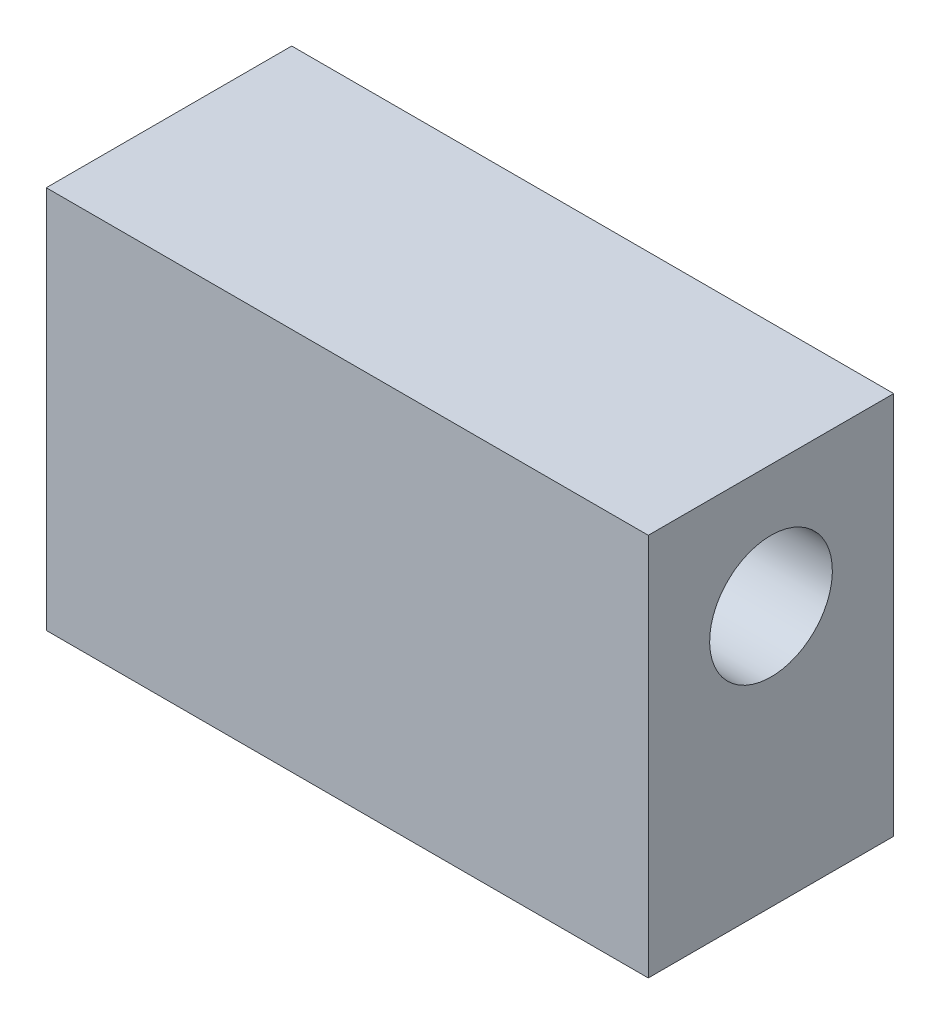
ISO-10303-21;
HEADER;
FILE_DESCRIPTION(('STEP AP214'),'2;1');
FILE_NAME('part.step','',(''),(''),'','','');
FILE_SCHEMA(('AUTOMOTIVE_DESIGN { 1 0 10303 214 1 1 1 1 }'));
ENDSEC;
DATA;
#1=APPLICATION_CONTEXT('core data for automotive mechanical design processes');
#2=APPLICATION_PROTOCOL_DEFINITION('international standard','automotive_design',2000,#1);
#3=PRODUCT_CONTEXT('',#1,'mechanical');
#4=PRODUCT('Part','Part','',(#3));
#5=PRODUCT_RELATED_PRODUCT_CATEGORY('part','',(#4));
#6=PRODUCT_DEFINITION_FORMATION('','',#4);
#7=PRODUCT_DEFINITION_CONTEXT('part definition',#1,'design');
#8=PRODUCT_DEFINITION('design','',#6,#7);
#9=PRODUCT_DEFINITION_SHAPE('','',#8);
#10=(LENGTH_UNIT() NAMED_UNIT(*) SI_UNIT(.MILLI.,.METRE.));
#11=(NAMED_UNIT(*) PLANE_ANGLE_UNIT() SI_UNIT($,.RADIAN.));
#12=(NAMED_UNIT(*) SI_UNIT($,.STERADIAN.) SOLID_ANGLE_UNIT());
#13=UNCERTAINTY_MEASURE_WITH_UNIT(LENGTH_MEASURE(1.E-05),#10,'distance_accuracy_value','');
#14=(GEOMETRIC_REPRESENTATION_CONTEXT(3) GLOBAL_UNCERTAINTY_ASSIGNED_CONTEXT((#13)) GLOBAL_UNIT_ASSIGNED_CONTEXT((#10,
#11,#12)) REPRESENTATION_CONTEXT('',''));
#15=CARTESIAN_POINT('',(0.,0.,0.));
#16=DIRECTION('',(0.,0.,1.));
#17=DIRECTION('',(1.,0.,0.));
#18=AXIS2_PLACEMENT_3D('',#15,#16,#17);
#19=CARTESIAN_POINT('',(0.,-19.8376419710467,6.35));
#20=DIRECTION('',(0.,1.,0.));
#21=DIRECTION('',(-1.,0.,0.));
#22=AXIS2_PLACEMENT_3D('',#19,#20,#21);
#23=PLANE('',#22);
#24=CARTESIAN_POINT('',(23.3612811681514,-19.8376419710467,0.));
#25=DIRECTION('',(0.,1.,0.));
#26=DIRECTION('',(-1.,0.,0.));
#27=AXIS2_PLACEMENT_3D('',#24,#25,#26);
#28=ELLIPSE('',#27,3.66617420935412,3.175);
#29=CARTESIAN_POINT('',(19.6951069587973,-19.8376419710467,0.));
#30=VERTEX_POINT('',#29);
#31=EDGE_CURVE('E11',#30,#30,#28,.T.);
#32=ORIENTED_EDGE('',*,*,#31,.T.);
#33=EDGE_LOOP('',(#32));
#34=FACE_BOUND('',#33,.T.);
#35=DIRECTION('',(1.,0.,0.));
#36=VECTOR('',#35,1.);
#37=CARTESIAN_POINT('',(0.,-19.8376419710467,-6.35));
#38=LINE('',#37,#36);
#39=CARTESIAN_POINT('',(0.,-19.8376419710467,-6.35));
#40=VERTEX_POINT('',#39);
#41=CARTESIAN_POINT('',(31.1483748908686,-19.8376419710467,-6.35));
#42=VERTEX_POINT('',#41);
#43=EDGE_CURVE('E94',#40,#42,#38,.T.);
#44=ORIENTED_EDGE('',*,*,#43,.T.);
#45=DIRECTION('',(0.,0.,-1.));
#46=VECTOR('',#45,1.);
#47=CARTESIAN_POINT('',(31.1483748908686,-19.8376419710467,6.35));
#48=LINE('',#47,#46);
#49=CARTESIAN_POINT('',(31.1483748908686,-19.8376419710467,6.35));
#50=VERTEX_POINT('',#49);
#51=EDGE_CURVE('E92',#50,#42,#48,.T.);
#52=ORIENTED_EDGE('',*,*,#51,.F.);
#53=DIRECTION('',(1.,0.,0.));
#54=VECTOR('',#53,1.);
#55=CARTESIAN_POINT('',(0.,-19.8376419710467,6.35));
#56=LINE('',#55,#54);
#57=CARTESIAN_POINT('',(0.,-19.8376419710467,6.35));
#58=VERTEX_POINT('',#57);
#59=EDGE_CURVE('E84',#58,#50,#56,.T.);
#60=ORIENTED_EDGE('',*,*,#59,.F.);
#61=DIRECTION('',(0.,0.,-1.));
#62=VECTOR('',#61,1.);
#63=CARTESIAN_POINT('',(0.,-19.8376419710467,6.35));
#64=LINE('',#63,#62);
#65=EDGE_CURVE('E95',#58,#40,#64,.T.);
#66=ORIENTED_EDGE('',*,*,#65,.T.);
#67=EDGE_LOOP('',(#44,#52,#60,#66));
#68=FACE_BOUND('',#67,.T.);
#69=CARTESIAN_POINT('',(7.78709372271712,-19.8376419710467,0.));
#70=DIRECTION('',(0.,1.,0.));
#71=DIRECTION('',(1.,0.,0.));
#72=AXIS2_PLACEMENT_3D('',#69,#70,#71);
#73=ELLIPSE('',#72,3.66617420935413,3.175);
#74=CARTESIAN_POINT('',(11.4532679320712,-19.8376419710467,0.));
#75=VERTEX_POINT('',#74);
#76=EDGE_CURVE('E45',#75,#75,#73,.F.);
#77=ORIENTED_EDGE('',*,*,#76,.F.);
#78=EDGE_LOOP('',(#77));
#79=FACE_BOUND('',#78,.T.);
#80=ADVANCED_FACE('F36',(#34,#68,#79),#23,.F.);
#81=CARTESIAN_POINT('',(0.,0.,6.35));
#82=DIRECTION('',(1.,0.,0.));
#83=DIRECTION('',(0.,1.,0.));
#84=AXIS2_PLACEMENT_3D('',#81,#82,#83);
#85=PLANE('',#84);
#86=CARTESIAN_POINT('',(0.,-6.35,0.));
#87=DIRECTION('',(-1.,0.,0.));
#88=DIRECTION('',(0.,-1.,0.));
#89=AXIS2_PLACEMENT_3D('',#86,#87,#88);
#90=CIRCLE('',#89,3.175);
#91=CARTESIAN_POINT('',(0.,-9.525,0.));
#92=VERTEX_POINT('',#91);
#93=EDGE_CURVE('E196',#92,#92,#90,.T.);
#94=ORIENTED_EDGE('',*,*,#93,.F.);
#95=EDGE_LOOP('',(#94));
#96=FACE_BOUND('',#95,.T.);
#97=DIRECTION('',(0.,-1.,0.));
#98=VECTOR('',#97,1.);
#99=CARTESIAN_POINT('',(0.,0.,-6.35));
#100=LINE('',#99,#98);
#101=CARTESIAN_POINT('',(0.,0.,-6.35));
#102=VERTEX_POINT('',#101);
#103=EDGE_CURVE('E104',#102,#40,#100,.T.);
#104=ORIENTED_EDGE('',*,*,#103,.T.);
#105=ORIENTED_EDGE('',*,*,#65,.F.);
#106=DIRECTION('',(0.,-1.,0.));
#107=VECTOR('',#106,1.);
#108=CARTESIAN_POINT('',(0.,0.,6.35));
#109=LINE('',#108,#107);
#110=CARTESIAN_POINT('',(0.,0.,6.35));
#111=VERTEX_POINT('',#110);
#112=EDGE_CURVE('E89',#111,#58,#109,.T.);
#113=ORIENTED_EDGE('',*,*,#112,.F.);
#114=DIRECTION('',(0.,0.,-1.));
#115=VECTOR('',#114,1.);
#116=CARTESIAN_POINT('',(0.,0.,6.35));
#117=LINE('',#116,#115);
#118=EDGE_CURVE('E100',#111,#102,#117,.T.);
#119=ORIENTED_EDGE('',*,*,#118,.T.);
#120=EDGE_LOOP('',(#104,#105,#113,#119));
#121=FACE_BOUND('',#120,.T.);
#122=ADVANCED_FACE('F38',(#96,#121),#85,.F.);
#123=CARTESIAN_POINT('',(31.1483748908686,0.,6.35));
#124=DIRECTION('',(-1.,0.,0.));
#125=DIRECTION('',(0.,-1.,0.));
#126=AXIS2_PLACEMENT_3D('',#123,#124,#125);
#127=PLANE('',#126);
#128=CARTESIAN_POINT('',(31.1483748908686,-6.35,0.));
#129=DIRECTION('',(-1.,0.,0.));
#130=DIRECTION('',(0.,-1.,0.));
#131=AXIS2_PLACEMENT_3D('',#128,#129,#130);
#132=CIRCLE('',#131,3.175);
#133=CARTESIAN_POINT('',(31.1483748908686,-3.175,0.));
#134=VERTEX_POINT('',#133);
#135=EDGE_CURVE('E179',#134,#134,#132,.T.);
#136=ORIENTED_EDGE('',*,*,#135,.T.);
#137=EDGE_LOOP('',(#136));
#138=FACE_BOUND('',#137,.T.);
#139=DIRECTION('',(0.,1.,0.));
#140=VECTOR('',#139,1.);
#141=CARTESIAN_POINT('',(31.1483748908686,0.,-6.35));
#142=LINE('',#141,#140);
#143=CARTESIAN_POINT('',(31.1483748908686,0.,-6.35));
#144=VERTEX_POINT('',#143);
#145=EDGE_CURVE('E70',#42,#144,#142,.T.);
#146=ORIENTED_EDGE('',*,*,#145,.T.);
#147=DIRECTION('',(0.,0.,-1.));
#148=VECTOR('',#147,1.);
#149=CARTESIAN_POINT('',(31.1483748908686,0.,6.35));
#150=LINE('',#149,#148);
#151=CARTESIAN_POINT('',(31.1483748908686,0.,6.35));
#152=VERTEX_POINT('',#151);
#153=EDGE_CURVE('E96',#152,#144,#150,.T.);
#154=ORIENTED_EDGE('',*,*,#153,.F.);
#155=DIRECTION('',(0.,1.,0.));
#156=VECTOR('',#155,1.);
#157=CARTESIAN_POINT('',(31.1483748908686,0.,6.35));
#158=LINE('',#157,#156);
#159=EDGE_CURVE('E87',#50,#152,#158,.T.);
#160=ORIENTED_EDGE('',*,*,#159,.F.);
#161=ORIENTED_EDGE('',*,*,#51,.T.);
#162=EDGE_LOOP('',(#146,#154,#160,#161));
#163=FACE_BOUND('',#162,.T.);
#164=ADVANCED_FACE('F98',(#138,#163),#127,.F.);
#165=CARTESIAN_POINT('',(0.,0.,6.35));
#166=DIRECTION('',(0.,-1.,0.));
#167=DIRECTION('',(1.,0.,0.));
#168=AXIS2_PLACEMENT_3D('',#165,#166,#167);
#169=PLANE('',#168);
#170=DIRECTION('',(-1.,0.,0.));
#171=VECTOR('',#170,1.);
#172=CARTESIAN_POINT('',(0.,0.,-6.35));
#173=LINE('',#172,#171);
#174=EDGE_CURVE('E76',#144,#102,#173,.T.);
#175=ORIENTED_EDGE('',*,*,#174,.T.);
#176=ORIENTED_EDGE('',*,*,#118,.F.);
#177=DIRECTION('',(-1.,0.,0.));
#178=VECTOR('',#177,1.);
#179=CARTESIAN_POINT('',(0.,0.,6.35));
#180=LINE('',#179,#178);
#181=EDGE_CURVE('E53',#152,#111,#180,.T.);
#182=ORIENTED_EDGE('',*,*,#181,.F.);
#183=ORIENTED_EDGE('',*,*,#153,.T.);
#184=EDGE_LOOP('',(#175,#176,#182,#183));
#185=FACE_BOUND('',#184,.T.);
#186=ADVANCED_FACE('F126',(#185),#169,.F.);
#187=CARTESIAN_POINT('',(0.,0.,6.35));
#188=DIRECTION('',(0.,0.,1.));
#189=DIRECTION('',(1.,0.,0.));
#190=AXIS2_PLACEMENT_3D('',#187,#188,#189);
#191=PLANE('',#190);
#192=ORIENTED_EDGE('',*,*,#112,.T.);
#193=ORIENTED_EDGE('',*,*,#59,.T.);
#194=ORIENTED_EDGE('',*,*,#159,.T.);
#195=ORIENTED_EDGE('',*,*,#181,.T.);
#196=EDGE_LOOP('',(#192,#193,#194,#195));
#197=FACE_BOUND('',#196,.T.);
#198=ADVANCED_FACE('F85',(#197),#191,.T.);
#199=CARTESIAN_POINT('',(0.,0.,-6.35));
#200=DIRECTION('',(0.,0.,1.));
#201=DIRECTION('',(1.,0.,0.));
#202=AXIS2_PLACEMENT_3D('',#199,#200,#201);
#203=PLANE('',#202);
#204=CARTESIAN_POINT('',(15.5741874454343,-6.35,-6.35));
#205=DIRECTION('',(0.,0.,-1.));
#206=DIRECTION('',(-1.,0.,0.));
#207=AXIS2_PLACEMENT_3D('',#204,#205,#206);
#208=CIRCLE('',#207,3.175);
#209=CARTESIAN_POINT('',(12.3991874454343,-6.35,-6.35));
#210=VERTEX_POINT('',#209);
#211=EDGE_CURVE('E186',#210,#210,#208,.T.);
#212=ORIENTED_EDGE('',*,*,#211,.F.);
#213=EDGE_LOOP('',(#212));
#214=FACE_BOUND('',#213,.T.);
#215=ORIENTED_EDGE('',*,*,#103,.F.);
#216=ORIENTED_EDGE('',*,*,#174,.F.);
#217=ORIENTED_EDGE('',*,*,#145,.F.);
#218=ORIENTED_EDGE('',*,*,#43,.F.);
#219=EDGE_LOOP('',(#215,#216,#217,#218));
#220=FACE_BOUND('',#219,.T.);
#221=ADVANCED_FACE('F130',(#214,#220),#203,.F.);
#222=CARTESIAN_POINT('',(9.525,-6.35,0.));
#223=DIRECTION('',(-1.,0.,0.));
#224=DIRECTION('',(0.,-1.,0.));
#225=AXIS2_PLACEMENT_3D('',#222,#223,#224);
#226=CYLINDRICAL_SURFACE('',#225,3.175);
#227=CARTESIAN_POINT('',(9.525,-6.35,0.));
#228=DIRECTION('',(-1.,0.,0.));
#229=DIRECTION('',(0.,-1.,0.));
#230=AXIS2_PLACEMENT_3D('',#227,#228,#229);
#231=CIRCLE('',#230,3.175);
#232=CARTESIAN_POINT('',(9.525,-9.525,0.));
#233=VERTEX_POINT('',#232);
#234=EDGE_CURVE('E107',#233,#233,#231,.T.);
#235=CARTESIAN_POINT('',(9.525,-9.525,0.));
#236=CARTESIAN_POINT('',(9.42578125,-9.525,0.));
#237=CARTESIAN_POINT('',(9.3265625,-9.525,0.));
#238=CARTESIAN_POINT('',(9.128125,-9.525,0.));
#239=CARTESIAN_POINT('',(9.02890625,-9.525,0.));
#240=CARTESIAN_POINT('',(8.83046875,-9.525,0.));
#241=CARTESIAN_POINT('',(8.73125,-9.525,0.));
#242=CARTESIAN_POINT('',(8.5328125,-9.525,0.));
#243=CARTESIAN_POINT('',(8.43359375,-9.525,0.));
#244=CARTESIAN_POINT('',(8.23515625,-9.525,0.));
#245=CARTESIAN_POINT('',(8.1359375,-9.525,0.));
#246=CARTESIAN_POINT('',(7.9375,-9.525,0.));
#247=CARTESIAN_POINT('',(7.83828125,-9.525,0.));
#248=CARTESIAN_POINT('',(7.63984375,-9.525,0.));
#249=CARTESIAN_POINT('',(7.540625,-9.525,0.));
#250=CARTESIAN_POINT('',(7.3421875,-9.525,0.));
#251=CARTESIAN_POINT('',(7.24296875,-9.525,0.));
#252=CARTESIAN_POINT('',(7.04453125,-9.525,0.));
#253=CARTESIAN_POINT('',(6.9453125,-9.525,0.));
#254=CARTESIAN_POINT('',(6.746875,-9.525,0.));
#255=CARTESIAN_POINT('',(6.64765625,-9.525,0.));
#256=CARTESIAN_POINT('',(6.44921875,-9.525,0.));
#257=CARTESIAN_POINT('',(6.35,-9.525,0.));
#258=CARTESIAN_POINT('',(6.1515625,-9.525,0.));
#259=CARTESIAN_POINT('',(6.05234375,-9.525,0.));
#260=CARTESIAN_POINT('',(5.85390625,-9.525,0.));
#261=CARTESIAN_POINT('',(5.7546875,-9.525,0.));
#262=CARTESIAN_POINT('',(5.55625,-9.525,0.));
#263=CARTESIAN_POINT('',(5.45703125,-9.525,0.));
#264=CARTESIAN_POINT('',(5.25859375,-9.525,0.));
#265=CARTESIAN_POINT('',(5.159375,-9.525,0.));
#266=CARTESIAN_POINT('',(4.9609375,-9.525,0.));
#267=CARTESIAN_POINT('',(4.86171875,-9.525,0.));
#268=CARTESIAN_POINT('',(4.66328125,-9.525,0.));
#269=CARTESIAN_POINT('',(4.5640625,-9.525,0.));
#270=CARTESIAN_POINT('',(4.365625,-9.525,0.));
#271=CARTESIAN_POINT('',(4.26640625,-9.525,0.));
#272=CARTESIAN_POINT('',(4.06796875,-9.525,0.));
#273=CARTESIAN_POINT('',(3.96875,-9.525,0.));
#274=CARTESIAN_POINT('',(3.7703125,-9.525,0.));
#275=CARTESIAN_POINT('',(3.67109375,-9.525,0.));
#276=CARTESIAN_POINT('',(3.47265625,-9.525,0.));
#277=CARTESIAN_POINT('',(3.3734375,-9.525,0.));
#278=CARTESIAN_POINT('',(3.175,-9.525,0.));
#279=CARTESIAN_POINT('',(3.07578125,-9.525,0.));
#280=CARTESIAN_POINT('',(2.87734375,-9.525,0.));
#281=CARTESIAN_POINT('',(2.778125,-9.525,0.));
#282=CARTESIAN_POINT('',(2.5796875,-9.525,0.));
#283=CARTESIAN_POINT('',(2.48046875,-9.525,0.));
#284=CARTESIAN_POINT('',(2.28203125,-9.525,0.));
#285=CARTESIAN_POINT('',(2.1828125,-9.525,0.));
#286=CARTESIAN_POINT('',(1.984375,-9.525,0.));
#287=CARTESIAN_POINT('',(1.88515625,-9.525,0.));
#288=CARTESIAN_POINT('',(1.68671875,-9.525,0.));
#289=CARTESIAN_POINT('',(1.5875,-9.525,0.));
#290=CARTESIAN_POINT('',(1.3890625,-9.525,0.));
#291=CARTESIAN_POINT('',(1.28984375,-9.525,0.));
#292=CARTESIAN_POINT('',(1.09140625,-9.525,0.));
#293=CARTESIAN_POINT('',(0.992187500000001,-9.525,0.));
#294=CARTESIAN_POINT('',(0.793750000000001,-9.525,0.));
#295=CARTESIAN_POINT('',(0.69453125,-9.525,0.));
#296=CARTESIAN_POINT('',(0.49609375,-9.525,0.));
#297=CARTESIAN_POINT('',(0.396875,-9.525,0.));
#298=CARTESIAN_POINT('',(0.1984375,-9.525,0.));
#299=CARTESIAN_POINT('',(0.0992187500000001,-9.525,0.));
#300=CARTESIAN_POINT('',(0.,-9.525,0.));
#301=B_SPLINE_CURVE_WITH_KNOTS('',3,(#235,#236,#237,#238,#239,#240,#241,#242,#243,#244,#245,
#246,#247,#248,#249,#250,#251,#252,#253,#254,#255,#256,#257,#258,#259,#260,#261,#262,#263,#264,
#265,#266,#267,#268,#269,#270,#271,#272,#273,#274,#275,#276,#277,#278,#279,#280,#281,#282,#283,
#284,#285,#286,#287,#288,#289,#290,#291,#292,#293,#294,#295,#296,#297,#298,#299,#300),
.UNSPECIFIED.,.F.,.F.,(4,2,2,2,2,2,2,2,2,2,2,2,2,2,2,2,2,2,2,2,2,2,2,2,2,2,2,2,2,2,2,2,4),(0.,
0.297656249999998,0.595312499999999,0.892968749999999,1.190625,1.48828125,1.7859375,2.08359375,
2.38125,2.67890625,2.9765625,3.27421875,3.571875,3.86953125,4.1671875,4.46484375,4.7625,
5.06015625,5.3578125,5.65546875,5.953125,6.25078125,6.5484375,6.84609375,7.14375,7.44140625,
7.7390625,8.03671875,8.334375,8.63203125,8.9296875,9.22734375,9.525),.UNSPECIFIED.);
#302=EDGE_CURVE('BSEAM133',#233,#92,#301,.T.);
#303=ORIENTED_EDGE('',*,*,#234,.F.);
#304=ORIENTED_EDGE('',*,*,#93,.T.);
#305=ORIENTED_EDGE('',*,*,#302,.T.);
#306=ORIENTED_EDGE('',*,*,#302,.F.);
#307=EDGE_LOOP('',(#303,#305,#304,#306));
#308=FACE_BOUND('',#307,.T.);
#309=ADVANCED_FACE('F133',(#308),#226,.F.);
#310=CARTESIAN_POINT('',(9.525,-6.35,0.));
#311=DIRECTION('',(-1.,0.,0.));
#312=DIRECTION('',(0.,-1.,0.));
#313=AXIS2_PLACEMENT_3D('',#310,#311,#312);
#314=PLANE('',#313);
#315=ORIENTED_EDGE('',*,*,#234,.T.);
#316=EDGE_LOOP('',(#315));
#317=FACE_BOUND('',#316,.T.);
#318=ADVANCED_FACE('F139',(#317),#314,.T.);
#319=CARTESIAN_POINT('',(5.83963727933594,-23.2107354765103,0.));
#320=DIRECTION('',(0.500000000000001,0.866025403784438,0.));
#321=DIRECTION('',(-0.866025403784438,0.500000000000001,0.));
#322=AXIS2_PLACEMENT_3D('',#319,#320,#321);
#323=CYLINDRICAL_SURFACE('',#322,3.175);
#324=CARTESIAN_POINT('',(12.5495937227171,-11.58875,0.));
#325=DIRECTION('',(-0.500000000000001,-0.866025403784438,0.));
#326=DIRECTION('',(0.866025403784438,-0.500000000000001,0.));
#327=AXIS2_PLACEMENT_3D('',#324,#325,#326);
#328=CIRCLE('',#327,3.175);
#329=CARTESIAN_POINT('',(15.2992243797327,-13.17625,0.));
#330=VERTEX_POINT('',#329);
#331=EDGE_CURVE('E191',#330,#330,#328,.T.);
#332=ORIENTED_EDGE('',*,*,#331,.F.);
#333=EDGE_LOOP('',(#332));
#334=FACE_BOUND('',#333,.T.);
#335=ORIENTED_EDGE('',*,*,#76,.T.);
#336=EDGE_LOOP('',(#335));
#337=FACE_BOUND('',#336,.T.);
#338=ADVANCED_FACE('F116',(#334,#337),#323,.F.);
#339=CARTESIAN_POINT('',(12.5495937227171,-11.58875,0.));
#340=DIRECTION('',(-0.500000000000001,-0.866025403784438,0.));
#341=DIRECTION('',(0.866025403784438,-0.500000000000001,0.));
#342=AXIS2_PLACEMENT_3D('',#339,#340,#341);
#343=PLANE('',#342);
#344=ORIENTED_EDGE('',*,*,#331,.T.);
#345=EDGE_LOOP('',(#344));
#346=FACE_BOUND('',#345,.T.);
#347=ADVANCED_FACE('F146',(#346),#343,.T.);
#348=CARTESIAN_POINT('',(15.5741874454343,-6.35,3.175));
#349=DIRECTION('',(0.,0.,-1.));
#350=DIRECTION('',(-1.,0.,0.));
#351=AXIS2_PLACEMENT_3D('',#348,#349,#350);
#352=CYLINDRICAL_SURFACE('',#351,3.175);
#353=CARTESIAN_POINT('',(15.5741874454343,-6.35,3.175));
#354=DIRECTION('',(0.,0.,-1.));
#355=DIRECTION('',(-1.,0.,0.));
#356=AXIS2_PLACEMENT_3D('',#353,#354,#355);
#357=CIRCLE('',#356,3.175);
#358=CARTESIAN_POINT('',(12.3991874454343,-6.35,3.175));
#359=VERTEX_POINT('',#358);
#360=EDGE_CURVE('E188',#359,#359,#357,.T.);
#361=CARTESIAN_POINT('',(12.3991874454343,-6.35,3.175));
#362=CARTESIAN_POINT('',(12.3991874454343,-6.35,3.07578125));
#363=CARTESIAN_POINT('',(12.3991874454343,-6.35,2.9765625));
#364=CARTESIAN_POINT('',(12.3991874454343,-6.35,2.778125));
#365=CARTESIAN_POINT('',(12.3991874454343,-6.35,2.67890625));
#366=CARTESIAN_POINT('',(12.3991874454343,-6.35,2.48046875));
#367=CARTESIAN_POINT('',(12.3991874454343,-6.35,2.38125));
#368=CARTESIAN_POINT('',(12.3991874454343,-6.35,2.1828125));
#369=CARTESIAN_POINT('',(12.3991874454343,-6.35,2.08359375));
#370=CARTESIAN_POINT('',(12.3991874454343,-6.35,1.88515625));
#371=CARTESIAN_POINT('',(12.3991874454343,-6.35,1.7859375));
#372=CARTESIAN_POINT('',(12.3991874454343,-6.35,1.5875));
#373=CARTESIAN_POINT('',(12.3991874454343,-6.35,1.48828125));
#374=CARTESIAN_POINT('',(12.3991874454343,-6.35,1.28984375));
#375=CARTESIAN_POINT('',(12.3991874454343,-6.35,1.190625));
#376=CARTESIAN_POINT('',(12.3991874454343,-6.35,0.992187500000001));
#377=CARTESIAN_POINT('',(12.3991874454343,-6.35,0.892968750000001));
#378=CARTESIAN_POINT('',(12.3991874454343,-6.35,0.694531250000001));
#379=CARTESIAN_POINT('',(12.3991874454343,-6.35,0.5953125));
#380=CARTESIAN_POINT('',(12.3991874454343,-6.35,0.396875));
#381=CARTESIAN_POINT('',(12.3991874454343,-6.35,0.29765625));
#382=CARTESIAN_POINT('',(12.3991874454343,-6.35,0.0992187500000004));
#383=CARTESIAN_POINT('',(12.3991874454343,-6.35,0.));
#384=CARTESIAN_POINT('',(12.3991874454343,-6.35,-0.1984375));
#385=CARTESIAN_POINT('',(12.3991874454343,-6.35,-0.29765625));
#386=CARTESIAN_POINT('',(12.3991874454343,-6.35,-0.49609375));
#387=CARTESIAN_POINT('',(12.3991874454343,-6.35,-0.5953125));
#388=CARTESIAN_POINT('',(12.3991874454343,-6.35,-0.79375));
#389=CARTESIAN_POINT('',(12.3991874454343,-6.35,-0.892968749999999));
#390=CARTESIAN_POINT('',(12.3991874454343,-6.35,-1.09140625));
#391=CARTESIAN_POINT('',(12.3991874454343,-6.35,-1.190625));
#392=CARTESIAN_POINT('',(12.3991874454343,-6.35,-1.3890625));
#393=CARTESIAN_POINT('',(12.3991874454343,-6.35,-1.48828125));
#394=CARTESIAN_POINT('',(12.3991874454343,-6.35,-1.68671875));
#395=CARTESIAN_POINT('',(12.3991874454343,-6.35,-1.7859375));
#396=CARTESIAN_POINT('',(12.3991874454343,-6.35,-1.984375));
#397=CARTESIAN_POINT('',(12.3991874454343,-6.35,-2.08359375));
#398=CARTESIAN_POINT('',(12.3991874454343,-6.35,-2.28203125));
#399=CARTESIAN_POINT('',(12.3991874454343,-6.35,-2.38125));
#400=CARTESIAN_POINT('',(12.3991874454343,-6.35,-2.5796875));
#401=CARTESIAN_POINT('',(12.3991874454343,-6.35,-2.67890625));
#402=CARTESIAN_POINT('',(12.3991874454343,-6.35,-2.87734375));
#403=CARTESIAN_POINT('',(12.3991874454343,-6.35,-2.9765625));
#404=CARTESIAN_POINT('',(12.3991874454343,-6.35,-3.175));
#405=CARTESIAN_POINT('',(12.3991874454343,-6.35,-3.27421875));
#406=CARTESIAN_POINT('',(12.3991874454343,-6.35,-3.47265625));
#407=CARTESIAN_POINT('',(12.3991874454343,-6.35,-3.571875));
#408=CARTESIAN_POINT('',(12.3991874454343,-6.35,-3.7703125));
#409=CARTESIAN_POINT('',(12.3991874454343,-6.35,-3.86953125));
#410=CARTESIAN_POINT('',(12.3991874454343,-6.35,-4.06796875));
#411=CARTESIAN_POINT('',(12.3991874454343,-6.35,-4.1671875));
#412=CARTESIAN_POINT('',(12.3991874454343,-6.35,-4.365625));
#413=CARTESIAN_POINT('',(12.3991874454343,-6.35,-4.46484375));
#414=CARTESIAN_POINT('',(12.3991874454343,-6.35,-4.66328125));
#415=CARTESIAN_POINT('',(12.3991874454343,-6.35,-4.7625));
#416=CARTESIAN_POINT('',(12.3991874454343,-6.35,-4.9609375));
#417=CARTESIAN_POINT('',(12.3991874454343,-6.35,-5.06015625));
#418=CARTESIAN_POINT('',(12.3991874454343,-6.35,-5.25859375));
#419=CARTESIAN_POINT('',(12.3991874454343,-6.35,-5.3578125));
#420=CARTESIAN_POINT('',(12.3991874454343,-6.35,-5.55625));
#421=CARTESIAN_POINT('',(12.3991874454343,-6.35,-5.65546875));
#422=CARTESIAN_POINT('',(12.3991874454343,-6.35,-5.85390625));
#423=CARTESIAN_POINT('',(12.3991874454343,-6.35,-5.953125));
#424=CARTESIAN_POINT('',(12.3991874454343,-6.35,-6.1515625));
#425=CARTESIAN_POINT('',(12.3991874454343,-6.35,-6.25078125));
#426=CARTESIAN_POINT('',(12.3991874454343,-6.35,-6.35));
#427=B_SPLINE_CURVE_WITH_KNOTS('',3,(#361,#362,#363,#364,#365,#366,#367,#368,#369,#370,#371,
#372,#373,#374,#375,#376,#377,#378,#379,#380,#381,#382,#383,#384,#385,#386,#387,#388,#389,#390,
#391,#392,#393,#394,#395,#396,#397,#398,#399,#400,#401,#402,#403,#404,#405,#406,#407,#408,#409,
#410,#411,#412,#413,#414,#415,#416,#417,#418,#419,#420,#421,#422,#423,#424,#425,#426),
.UNSPECIFIED.,.F.,.F.,(4,2,2,2,2,2,2,2,2,2,2,2,2,2,2,2,2,2,2,2,2,2,2,2,2,2,2,2,2,2,2,2,4),(0.,
0.29765625,0.5953125,0.89296875,1.190625,1.48828125,1.7859375,2.08359375,2.38125,2.67890625,
2.9765625,3.27421875,3.571875,3.86953125,4.1671875,4.46484375,4.7625,5.06015625,5.3578125,
5.65546875,5.953125,6.25078125,6.5484375,6.84609375,7.14375,7.44140625,7.7390625,8.03671875,
8.334375,8.63203125,8.9296875,9.22734375,9.525),.UNSPECIFIED.);
#428=EDGE_CURVE('BSEAM150',#359,#210,#427,.T.);
#429=ORIENTED_EDGE('',*,*,#360,.F.);
#430=ORIENTED_EDGE('',*,*,#211,.T.);
#431=ORIENTED_EDGE('',*,*,#428,.T.);
#432=ORIENTED_EDGE('',*,*,#428,.F.);
#433=EDGE_LOOP('',(#429,#431,#430,#432));
#434=FACE_BOUND('',#433,.T.);
#435=ADVANCED_FACE('F150',(#434),#352,.F.);
#436=CARTESIAN_POINT('',(15.5741874454343,-6.35,3.175));
#437=DIRECTION('',(0.,0.,-1.));
#438=DIRECTION('',(-1.,0.,0.));
#439=AXIS2_PLACEMENT_3D('',#436,#437,#438);
#440=PLANE('',#439);
#441=ORIENTED_EDGE('',*,*,#360,.T.);
#442=EDGE_LOOP('',(#441));
#443=FACE_BOUND('',#442,.T.);
#444=ADVANCED_FACE('F154',(#443),#440,.T.);
#445=CARTESIAN_POINT('',(21.6233748908686,-6.35,0.));
#446=DIRECTION('',(1.,0.,0.));
#447=DIRECTION('',(0.,1.,0.));
#448=AXIS2_PLACEMENT_3D('',#445,#446,#447);
#449=CYLINDRICAL_SURFACE('',#448,3.175);
#450=CARTESIAN_POINT('',(21.6233748908686,-6.35,0.));
#451=DIRECTION('',(-1.,0.,0.));
#452=DIRECTION('',(0.,-1.,0.));
#453=AXIS2_PLACEMENT_3D('',#450,#451,#452);
#454=CIRCLE('',#453,3.175);
#455=CARTESIAN_POINT('',(21.6233748908686,-3.175,0.));
#456=VERTEX_POINT('',#455);
#457=EDGE_CURVE('E182',#456,#456,#454,.T.);
#458=CARTESIAN_POINT('',(21.6233748908686,-3.175,0.));
#459=CARTESIAN_POINT('',(21.7225936408686,-3.175,0.));
#460=CARTESIAN_POINT('',(21.8218123908685,-3.175,0.));
#461=CARTESIAN_POINT('',(22.0202498908686,-3.175,0.));
#462=CARTESIAN_POINT('',(22.1194686408686,-3.175,0.));
#463=CARTESIAN_POINT('',(22.3179061408686,-3.175,0.));
#464=CARTESIAN_POINT('',(22.4171248908685,-3.175,0.));
#465=CARTESIAN_POINT('',(22.6155623908686,-3.175,0.));
#466=CARTESIAN_POINT('',(22.7147811408685,-3.175,0.));
#467=CARTESIAN_POINT('',(22.9132186408686,-3.175,0.));
#468=CARTESIAN_POINT('',(23.0124373908685,-3.175,0.));
#469=CARTESIAN_POINT('',(23.2108748908686,-3.175,0.));
#470=CARTESIAN_POINT('',(23.3100936408686,-3.175,0.));
#471=CARTESIAN_POINT('',(23.5085311408686,-3.175,0.));
#472=CARTESIAN_POINT('',(23.6077498908686,-3.175,0.));
#473=CARTESIAN_POINT('',(23.8061873908686,-3.175,0.));
#474=CARTESIAN_POINT('',(23.9054061408685,-3.175,0.));
#475=CARTESIAN_POINT('',(24.1038436408686,-3.175,0.));
#476=CARTESIAN_POINT('',(24.2030623908685,-3.175,0.));
#477=CARTESIAN_POINT('',(24.4014998908686,-3.175,0.));
#478=CARTESIAN_POINT('',(24.5007186408686,-3.175,0.));
#479=CARTESIAN_POINT('',(24.6991561408686,-3.175,0.));
#480=CARTESIAN_POINT('',(24.7983748908686,-3.175,0.));
#481=CARTESIAN_POINT('',(24.9968123908686,-3.175,0.));
#482=CARTESIAN_POINT('',(25.0960311408686,-3.175,0.));
#483=CARTESIAN_POINT('',(25.2944686408686,-3.175,0.));
#484=CARTESIAN_POINT('',(25.3936873908685,-3.175,0.));
#485=CARTESIAN_POINT('',(25.5921248908686,-3.175,0.));
#486=CARTESIAN_POINT('',(25.6913436408686,-3.175,0.));
#487=CARTESIAN_POINT('',(25.8897811408685,-3.175,0.));
#488=CARTESIAN_POINT('',(25.9889998908685,-3.175,0.));
#489=CARTESIAN_POINT('',(26.1874373908685,-3.175,0.));
#490=CARTESIAN_POINT('',(26.2866561408685,-3.175,0.));
#491=CARTESIAN_POINT('',(26.4850936408686,-3.175,0.));
#492=CARTESIAN_POINT('',(26.5843123908685,-3.175,0.));
#493=CARTESIAN_POINT('',(26.7827498908686,-3.175,0.));
#494=CARTESIAN_POINT('',(26.8819686408685,-3.175,0.));
#495=CARTESIAN_POINT('',(27.0804061408686,-3.175,0.));
#496=CARTESIAN_POINT('',(27.1796248908685,-3.175,0.));
#497=CARTESIAN_POINT('',(27.3780623908685,-3.175,0.));
#498=CARTESIAN_POINT('',(27.4772811408685,-3.175,0.));
#499=CARTESIAN_POINT('',(27.6757186408686,-3.175,0.));
#500=CARTESIAN_POINT('',(27.7749373908685,-3.175,0.));
#501=CARTESIAN_POINT('',(27.9733748908686,-3.175,0.));
#502=CARTESIAN_POINT('',(28.0725936408686,-3.175,0.));
#503=CARTESIAN_POINT('',(28.2710311408686,-3.175,0.));
#504=CARTESIAN_POINT('',(28.3702498908685,-3.175,0.));
#505=CARTESIAN_POINT('',(28.5686873908686,-3.175,0.));
#506=CARTESIAN_POINT('',(28.6679061408685,-3.175,0.));
#507=CARTESIAN_POINT('',(28.8663436408686,-3.175,0.));
#508=CARTESIAN_POINT('',(28.9655623908685,-3.175,0.));
#509=CARTESIAN_POINT('',(29.1639998908686,-3.175,0.));
#510=CARTESIAN_POINT('',(29.2632186408686,-3.175,0.));
#511=CARTESIAN_POINT('',(29.4616561408686,-3.175,0.));
#512=CARTESIAN_POINT('',(29.5608748908686,-3.175,0.));
#513=CARTESIAN_POINT('',(29.7593123908686,-3.175,0.));
#514=CARTESIAN_POINT('',(29.8585311408685,-3.175,0.));
#515=CARTESIAN_POINT('',(30.0569686408686,-3.175,0.));
#516=CARTESIAN_POINT('',(30.1561873908685,-3.175,0.));
#517=CARTESIAN_POINT('',(30.3546248908686,-3.175,0.));
#518=CARTESIAN_POINT('',(30.4538436408686,-3.175,0.));
#519=CARTESIAN_POINT('',(30.6522811408686,-3.175,0.));
#520=CARTESIAN_POINT('',(30.7514998908686,-3.175,0.));
#521=CARTESIAN_POINT('',(30.9499373908686,-3.175,0.));
#522=CARTESIAN_POINT('',(31.0491561408686,-3.175,0.));
#523=CARTESIAN_POINT('',(31.1483748908686,-3.175,0.));
#524=B_SPLINE_CURVE_WITH_KNOTS('',3,(#458,#459,#460,#461,#462,#463,#464,#465,#466,#467,#468,
#469,#470,#471,#472,#473,#474,#475,#476,#477,#478,#479,#480,#481,#482,#483,#484,#485,#486,#487,
#488,#489,#490,#491,#492,#493,#494,#495,#496,#497,#498,#499,#500,#501,#502,#503,#504,#505,#506,
#507,#508,#509,#510,#511,#512,#513,#514,#515,#516,#517,#518,#519,#520,#521,#522,#523),
.UNSPECIFIED.,.F.,.F.,(4,2,2,2,2,2,2,2,2,2,2,2,2,2,2,2,2,2,2,2,2,2,2,2,2,2,2,2,2,2,2,2,4),(0.,
0.29765625,0.5953125,0.892968750000001,1.190625,1.48828125,1.7859375,2.08359375,2.38125,
2.67890625,2.9765625,3.27421875,3.571875,3.86953125,4.1671875,4.46484375,4.7625,5.06015625,
5.3578125,5.65546875,5.953125,6.25078125,6.5484375,6.84609375,7.14375,7.44140625,7.7390625,
8.03671875,8.334375,8.63203125,8.9296875,9.22734375,9.525),.UNSPECIFIED.);
#525=EDGE_CURVE('BSEAM158',#456,#134,#524,.T.);
#526=ORIENTED_EDGE('',*,*,#457,.T.);
#527=ORIENTED_EDGE('',*,*,#135,.F.);
#528=ORIENTED_EDGE('',*,*,#525,.T.);
#529=ORIENTED_EDGE('',*,*,#525,.F.);
#530=EDGE_LOOP('',(#526,#528,#527,#529));
#531=FACE_BOUND('',#530,.T.);
#532=ADVANCED_FACE('F158',(#531),#449,.F.);
#533=CARTESIAN_POINT('',(21.6233748908686,-6.35,0.));
#534=DIRECTION('',(1.,0.,0.));
#535=DIRECTION('',(0.,-1.,0.));
#536=AXIS2_PLACEMENT_3D('',#533,#534,#535);
#537=PLANE('',#536);
#538=ORIENTED_EDGE('',*,*,#457,.F.);
#539=EDGE_LOOP('',(#538));
#540=FACE_BOUND('',#539,.T.);
#541=ADVANCED_FACE('F162',(#540),#537,.T.);
#542=CARTESIAN_POINT('',(25.3087376115326,-23.2107354765103,0.));
#543=DIRECTION('',(-0.500000000000001,0.866025403784438,0.));
#544=DIRECTION('',(-0.866025403784438,-0.500000000000001,0.));
#545=AXIS2_PLACEMENT_3D('',#542,#543,#544);
#546=CYLINDRICAL_SURFACE('',#545,3.175);
#547=CARTESIAN_POINT('',(18.5987811681514,-11.58875,0.));
#548=DIRECTION('',(-0.500000000000001,0.866025403784438,0.));
#549=DIRECTION('',(-0.866025403784438,-0.500000000000001,0.));
#550=AXIS2_PLACEMENT_3D('',#547,#548,#549);
#551=CIRCLE('',#550,3.175);
#552=CARTESIAN_POINT('',(15.8491505111358,-13.17625,0.));
#553=VERTEX_POINT('',#552);
#554=EDGE_CURVE('E178',#553,#553,#551,.T.);
#555=ORIENTED_EDGE('',*,*,#554,.T.);
#556=EDGE_LOOP('',(#555));
#557=FACE_BOUND('',#556,.T.);
#558=ORIENTED_EDGE('',*,*,#31,.F.);
#559=EDGE_LOOP('',(#558));
#560=FACE_BOUND('',#559,.T.);
#561=ADVANCED_FACE('F166',(#557,#560),#546,.F.);
#562=CARTESIAN_POINT('',(18.5987811681514,-11.58875,0.));
#563=DIRECTION('',(0.500000000000001,-0.866025403784438,0.));
#564=DIRECTION('',(-0.866025403784438,-0.500000000000001,0.));
#565=AXIS2_PLACEMENT_3D('',#562,#563,#564);
#566=PLANE('',#565);
#567=ORIENTED_EDGE('',*,*,#554,.F.);
#568=EDGE_LOOP('',(#567));
#569=FACE_BOUND('',#568,.T.);
#570=ADVANCED_FACE('F170',(#569),#566,.T.);
#571=CLOSED_SHELL('',(#80,#122,#164,#186,#198,#221,#309,#318,#338,#347,#435,#444,#532,#541,#561,#570));
#572=MANIFOLD_SOLID_BREP('B2',#571);
#573=ADVANCED_BREP_SHAPE_REPRESENTATION('',(#18,#572),#14);
#574=SHAPE_DEFINITION_REPRESENTATION(#9,#573);
ENDSEC;
END-ISO-10303-21;
